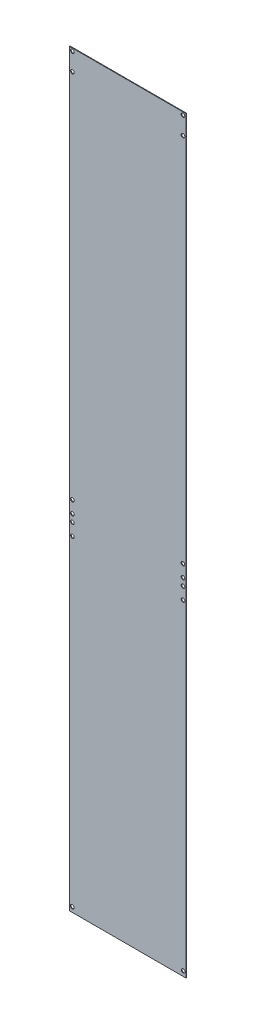
ISO-10303-21;
HEADER;
FILE_DESCRIPTION(('STEP AP214'),'2;1');
FILE_NAME('part.step','',(''),(''),'','','');
FILE_SCHEMA(('AUTOMOTIVE_DESIGN { 1 0 10303 214 1 1 1 1 }'));
ENDSEC;
DATA;
#1=APPLICATION_CONTEXT('core data for automotive mechanical design processes');
#2=APPLICATION_PROTOCOL_DEFINITION('international standard','automotive_design',2000,#1);
#3=PRODUCT_CONTEXT('',#1,'mechanical');
#4=PRODUCT('Part','Part','',(#3));
#5=PRODUCT_RELATED_PRODUCT_CATEGORY('part','',(#4));
#6=PRODUCT_DEFINITION_FORMATION('','',#4);
#7=PRODUCT_DEFINITION_CONTEXT('part definition',#1,'design');
#8=PRODUCT_DEFINITION('design','',#6,#7);
#9=PRODUCT_DEFINITION_SHAPE('','',#8);
#10=(LENGTH_UNIT() NAMED_UNIT(*) SI_UNIT(.MILLI.,.METRE.));
#11=(NAMED_UNIT(*) PLANE_ANGLE_UNIT() SI_UNIT($,.RADIAN.));
#12=(NAMED_UNIT(*) SI_UNIT($,.STERADIAN.) SOLID_ANGLE_UNIT());
#13=UNCERTAINTY_MEASURE_WITH_UNIT(LENGTH_MEASURE(1.E-05),#10,'distance_accuracy_value','');
#14=(GEOMETRIC_REPRESENTATION_CONTEXT(3) GLOBAL_UNCERTAINTY_ASSIGNED_CONTEXT((#13)) GLOBAL_UNIT_ASSIGNED_CONTEXT((#10,
#11,#12)) REPRESENTATION_CONTEXT('',''));
#15=CARTESIAN_POINT('',(0.,0.,0.));
#16=DIRECTION('',(0.,0.,1.));
#17=DIRECTION('',(1.,0.,0.));
#18=AXIS2_PLACEMENT_3D('',#15,#16,#17);
#19=CARTESIAN_POINT('',(0.,0.,3.175));
#20=DIRECTION('',(1.,0.,0.));
#21=DIRECTION('',(0.,0.,-1.));
#22=AXIS2_PLACEMENT_3D('',#19,#20,#21);
#23=PLANE('',#22);
#24=DIRECTION('',(0.,-1.,0.));
#25=VECTOR('',#24,1.);
#26=CARTESIAN_POINT('',(0.,0.,0.));
#27=LINE('',#26,#25);
#28=CARTESIAN_POINT('',(0.,3924.3,0.));
#29=VERTEX_POINT('',#28);
#30=CARTESIAN_POINT('',(0.,0.,0.));
#31=VERTEX_POINT('',#30);
#32=EDGE_CURVE('E107',#29,#31,#27,.T.);
#33=ORIENTED_EDGE('',*,*,#32,.T.);
#34=DIRECTION('',(0.,0.,-1.));
#35=VECTOR('',#34,1.);
#36=CARTESIAN_POINT('',(0.,0.,3.175));
#37=LINE('',#36,#35);
#38=CARTESIAN_POINT('',(0.,0.,3.175));
#39=VERTEX_POINT('',#38);
#40=EDGE_CURVE('E11',#39,#31,#37,.T.);
#41=ORIENTED_EDGE('',*,*,#40,.F.);
#42=DIRECTION('',(0.,-1.,0.));
#43=VECTOR('',#42,1.);
#44=CARTESIAN_POINT('',(0.,0.,3.175));
#45=LINE('',#44,#43);
#46=CARTESIAN_POINT('',(0.,3924.3,3.175));
#47=VERTEX_POINT('',#46);
#48=EDGE_CURVE('E94',#47,#39,#45,.T.);
#49=ORIENTED_EDGE('',*,*,#48,.F.);
#50=DIRECTION('',(0.,0.,-1.));
#51=VECTOR('',#50,1.);
#52=CARTESIAN_POINT('',(0.,3924.3,3.175));
#53=LINE('',#52,#51);
#54=EDGE_CURVE('E103',#47,#29,#53,.T.);
#55=ORIENTED_EDGE('',*,*,#54,.T.);
#56=EDGE_LOOP('',(#33,#41,#49,#55));
#57=FACE_BOUND('',#56,.T.);
#58=ADVANCED_FACE('F43',(#57),#23,.F.);
#59=CARTESIAN_POINT('',(0.,0.,3.175));
#60=DIRECTION('',(0.,1.,0.));
#61=DIRECTION('',(0.,0.,1.));
#62=AXIS2_PLACEMENT_3D('',#59,#60,#61);
#63=PLANE('',#62);
#64=DIRECTION('',(1.,0.,0.));
#65=VECTOR('',#64,1.);
#66=CARTESIAN_POINT('',(0.,0.,0.));
#67=LINE('',#66,#65);
#68=CARTESIAN_POINT('',(609.6,0.,0.));
#69=VERTEX_POINT('',#68);
#70=EDGE_CURVE('E98',#31,#69,#67,.T.);
#71=ORIENTED_EDGE('',*,*,#70,.T.);
#72=DIRECTION('',(0.,0.,-1.));
#73=VECTOR('',#72,1.);
#74=CARTESIAN_POINT('',(609.6,0.,3.175));
#75=LINE('',#74,#73);
#76=CARTESIAN_POINT('',(609.6,0.,3.175));
#77=VERTEX_POINT('',#76);
#78=EDGE_CURVE('E51',#77,#69,#75,.T.);
#79=ORIENTED_EDGE('',*,*,#78,.F.);
#80=DIRECTION('',(1.,0.,0.));
#81=VECTOR('',#80,1.);
#82=CARTESIAN_POINT('',(0.,0.,3.175));
#83=LINE('',#82,#81);
#84=EDGE_CURVE('E89',#39,#77,#83,.T.);
#85=ORIENTED_EDGE('',*,*,#84,.F.);
#86=ORIENTED_EDGE('',*,*,#40,.T.);
#87=EDGE_LOOP('',(#71,#79,#85,#86));
#88=FACE_BOUND('',#87,.T.);
#89=ADVANCED_FACE('F97',(#88),#63,.F.);
#90=CARTESIAN_POINT('',(609.6,0.,3.175));
#91=DIRECTION('',(-1.,0.,0.));
#92=DIRECTION('',(0.,0.,1.));
#93=AXIS2_PLACEMENT_3D('',#90,#91,#92);
#94=PLANE('',#93);
#95=DIRECTION('',(0.,1.,0.));
#96=VECTOR('',#95,1.);
#97=CARTESIAN_POINT('',(609.6,0.,0.));
#98=LINE('',#97,#96);
#99=CARTESIAN_POINT('',(609.6,3924.3,0.));
#100=VERTEX_POINT('',#99);
#101=EDGE_CURVE('E76',#69,#100,#98,.T.);
#102=ORIENTED_EDGE('',*,*,#101,.T.);
#103=DIRECTION('',(0.,0.,-1.));
#104=VECTOR('',#103,1.);
#105=CARTESIAN_POINT('',(609.6,3924.3,3.175));
#106=LINE('',#105,#104);
#107=CARTESIAN_POINT('',(609.6,3924.3,3.175));
#108=VERTEX_POINT('',#107);
#109=EDGE_CURVE('E99',#108,#100,#106,.T.);
#110=ORIENTED_EDGE('',*,*,#109,.F.);
#111=DIRECTION('',(0.,1.,0.));
#112=VECTOR('',#111,1.);
#113=CARTESIAN_POINT('',(609.6,0.,3.175));
#114=LINE('',#113,#112);
#115=EDGE_CURVE('E92',#77,#108,#114,.T.);
#116=ORIENTED_EDGE('',*,*,#115,.F.);
#117=ORIENTED_EDGE('',*,*,#78,.T.);
#118=EDGE_LOOP('',(#102,#110,#116,#117));
#119=FACE_BOUND('',#118,.T.);
#120=ADVANCED_FACE('F100',(#119),#94,.F.);
#121=CARTESIAN_POINT('',(0.,3924.3,3.175));
#122=DIRECTION('',(0.,-1.,0.));
#123=DIRECTION('',(0.,0.,-1.));
#124=AXIS2_PLACEMENT_3D('',#121,#122,#123);
#125=PLANE('',#124);
#126=DIRECTION('',(-1.,0.,0.));
#127=VECTOR('',#126,1.);
#128=CARTESIAN_POINT('',(0.,3924.3,0.));
#129=LINE('',#128,#127);
#130=EDGE_CURVE('E82',#100,#29,#129,.T.);
#131=ORIENTED_EDGE('',*,*,#130,.T.);
#132=ORIENTED_EDGE('',*,*,#54,.F.);
#133=DIRECTION('',(-1.,0.,0.));
#134=VECTOR('',#133,1.);
#135=CARTESIAN_POINT('',(0.,3924.3,3.175));
#136=LINE('',#135,#134);
#137=EDGE_CURVE('E59',#108,#47,#136,.T.);
#138=ORIENTED_EDGE('',*,*,#137,.F.);
#139=ORIENTED_EDGE('',*,*,#109,.T.);
#140=EDGE_LOOP('',(#131,#132,#138,#139));
#141=FACE_BOUND('',#140,.T.);
#142=ADVANCED_FACE('F117',(#141),#125,.F.);
#143=CARTESIAN_POINT('',(0.,0.,3.175));
#144=DIRECTION('',(0.,0.,-1.));
#145=DIRECTION('',(-1.,0.,0.));
#146=AXIS2_PLACEMENT_3D('',#143,#144,#145);
#147=PLANE('',#146);
#148=CARTESIAN_POINT('',(15.0837899999731,3816.34999999999,3.175));
#149=DIRECTION('',(0.,0.,-1.));
#150=DIRECTION('',(-1.,0.,0.));
#151=AXIS2_PLACEMENT_3D('',#148,#149,#150);
#152=CIRCLE('',#151,9.52500000000003);
#153=CARTESIAN_POINT('',(5.55878999997309,3816.34999999999,3.175));
#154=VERTEX_POINT('',#153);
#155=EDGE_CURVE('E157',#154,#154,#152,.T.);
#156=ORIENTED_EDGE('',*,*,#155,.T.);
#157=EDGE_LOOP('',(#156));
#158=FACE_BOUND('',#157,.T.);
#159=CARTESIAN_POINT('',(15.0837899999731,3909.25049999999,3.175));
#160=DIRECTION('',(0.,0.,-1.));
#161=DIRECTION('',(-1.,0.,0.));
#162=AXIS2_PLACEMENT_3D('',#159,#160,#161);
#163=CIRCLE('',#162,9.52500000000003);
#164=CARTESIAN_POINT('',(5.55878999997309,3909.25049999999,3.175));
#165=VERTEX_POINT('',#164);
#166=EDGE_CURVE('E166',#165,#165,#163,.T.);
#167=ORIENTED_EDGE('',*,*,#166,.T.);
#168=EDGE_LOOP('',(#167));
#169=FACE_BOUND('',#168,.T.);
#170=CARTESIAN_POINT('',(595.624919999987,25.3999999999857,3.175));
#171=DIRECTION('',(0.,0.,-1.));
#172=DIRECTION('',(-1.,0.,0.));
#173=AXIS2_PLACEMENT_3D('',#170,#171,#172);
#174=CIRCLE('',#173,9.52500000000002);
#175=CARTESIAN_POINT('',(586.099919999987,25.3999999999857,3.175));
#176=VERTEX_POINT('',#175);
#177=EDGE_CURVE('E174',#176,#176,#174,.T.);
#178=ORIENTED_EDGE('',*,*,#177,.T.);
#179=EDGE_LOOP('',(#178));
#180=FACE_BOUND('',#179,.T.);
#181=CARTESIAN_POINT('',(594.516209999955,1708.16015999999,3.175));
#182=DIRECTION('',(0.,0.,-1.));
#183=DIRECTION('',(-1.,0.,0.));
#184=AXIS2_PLACEMENT_3D('',#181,#182,#183);
#185=CIRCLE('',#184,9.52500000000005);
#186=CARTESIAN_POINT('',(584.991209999954,1708.16015999999,3.175));
#187=VERTEX_POINT('',#186);
#188=EDGE_CURVE('E180',#187,#187,#185,.T.);
#189=ORIENTED_EDGE('',*,*,#188,.T.);
#190=EDGE_LOOP('',(#189));
#191=FACE_BOUND('',#190,.T.);
#192=CARTESIAN_POINT('',(594.516209999953,1771.64999999999,3.175));
#193=DIRECTION('',(0.,0.,-1.));
#194=DIRECTION('',(-1.,0.,0.));
#195=AXIS2_PLACEMENT_3D('',#192,#193,#194);
#196=CIRCLE('',#195,9.52500000000005);
#197=CARTESIAN_POINT('',(584.991209999953,1771.64999999999,3.175));
#198=VERTEX_POINT('',#197);
#199=EDGE_CURVE('E131',#198,#198,#196,.T.);
#200=ORIENTED_EDGE('',*,*,#199,.T.);
#201=EDGE_LOOP('',(#200));
#202=FACE_BOUND('',#201,.T.);
#203=CARTESIAN_POINT('',(594.516209999973,1809.74999999999,3.175));
#204=DIRECTION('',(0.,0.,-1.));
#205=DIRECTION('',(-1.,0.,0.));
#206=AXIS2_PLACEMENT_3D('',#203,#204,#205);
#207=CIRCLE('',#206,9.52500000000005);
#208=CARTESIAN_POINT('',(584.991209999973,1809.74999999999,3.175));
#209=VERTEX_POINT('',#208);
#210=EDGE_CURVE('E138',#209,#209,#207,.T.);
#211=ORIENTED_EDGE('',*,*,#210,.T.);
#212=EDGE_LOOP('',(#211));
#213=FACE_BOUND('',#212,.T.);
#214=CARTESIAN_POINT('',(594.516209999993,1873.24491999999,3.175));
#215=DIRECTION('',(0.,0.,-1.));
#216=DIRECTION('',(-1.,0.,0.));
#217=AXIS2_PLACEMENT_3D('',#214,#215,#216);
#218=CIRCLE('',#217,9.52500000000005);
#219=CARTESIAN_POINT('',(584.991209999993,1873.24491999999,3.175));
#220=VERTEX_POINT('',#219);
#221=EDGE_CURVE('E146',#220,#220,#218,.T.);
#222=ORIENTED_EDGE('',*,*,#221,.T.);
#223=EDGE_LOOP('',(#222));
#224=FACE_BOUND('',#223,.T.);
#225=CARTESIAN_POINT('',(594.516209999955,3816.34999999999,3.175));
#226=DIRECTION('',(0.,0.,-1.));
#227=DIRECTION('',(-1.,0.,0.));
#228=AXIS2_PLACEMENT_3D('',#225,#226,#227);
#229=CIRCLE('',#228,9.52500000000005);
#230=CARTESIAN_POINT('',(584.991209999955,3816.34999999999,3.175));
#231=VERTEX_POINT('',#230);
#232=EDGE_CURVE('E152',#231,#231,#229,.T.);
#233=ORIENTED_EDGE('',*,*,#232,.T.);
#234=EDGE_LOOP('',(#233));
#235=FACE_BOUND('',#234,.T.);
#236=CARTESIAN_POINT('',(15.0837899999735,1873.24491999999,3.175));
#237=DIRECTION('',(0.,0.,-1.));
#238=DIRECTION('',(-1.,0.,0.));
#239=AXIS2_PLACEMENT_3D('',#236,#237,#238);
#240=CIRCLE('',#239,9.52500000000003);
#241=CARTESIAN_POINT('',(5.55878999997348,1873.24491999999,3.175));
#242=VERTEX_POINT('',#241);
#243=EDGE_CURVE('E214',#242,#242,#240,.T.);
#244=ORIENTED_EDGE('',*,*,#243,.T.);
#245=EDGE_LOOP('',(#244));
#246=FACE_BOUND('',#245,.T.);
#247=CARTESIAN_POINT('',(15.0837899999735,1809.74999999999,3.175));
#248=DIRECTION('',(0.,0.,-1.));
#249=DIRECTION('',(-1.,0.,0.));
#250=AXIS2_PLACEMENT_3D('',#247,#248,#249);
#251=CIRCLE('',#250,9.52500000000003);
#252=CARTESIAN_POINT('',(5.55878999997348,1809.74999999999,3.175));
#253=VERTEX_POINT('',#252);
#254=EDGE_CURVE('E206',#253,#253,#251,.T.);
#255=ORIENTED_EDGE('',*,*,#254,.T.);
#256=EDGE_LOOP('',(#255));
#257=FACE_BOUND('',#256,.T.);
#258=CARTESIAN_POINT('',(15.0837899999735,1771.64999999999,3.175));
#259=DIRECTION('',(0.,0.,-1.));
#260=DIRECTION('',(-1.,0.,0.));
#261=AXIS2_PLACEMENT_3D('',#258,#259,#260);
#262=CIRCLE('',#261,9.52500000000003);
#263=CARTESIAN_POINT('',(5.55878999997348,1771.64999999999,3.175));
#264=VERTEX_POINT('',#263);
#265=EDGE_CURVE('E198',#264,#264,#262,.T.);
#266=ORIENTED_EDGE('',*,*,#265,.T.);
#267=EDGE_LOOP('',(#266));
#268=FACE_BOUND('',#267,.T.);
#269=CARTESIAN_POINT('',(15.0837899999735,1708.16015999999,3.175));
#270=DIRECTION('',(0.,0.,-1.));
#271=DIRECTION('',(-1.,0.,0.));
#272=AXIS2_PLACEMENT_3D('',#269,#270,#271);
#273=CIRCLE('',#272,9.52500000000003);
#274=CARTESIAN_POINT('',(5.55878999997348,1708.16015999999,3.175));
#275=VERTEX_POINT('',#274);
#276=EDGE_CURVE('E191',#275,#275,#273,.T.);
#277=ORIENTED_EDGE('',*,*,#276,.T.);
#278=EDGE_LOOP('',(#277));
#279=FACE_BOUND('',#278,.T.);
#280=CARTESIAN_POINT('',(13.9750799999746,25.3999999999857,3.175));
#281=DIRECTION('',(0.,0.,-1.));
#282=DIRECTION('',(-1.,0.,0.));
#283=AXIS2_PLACEMENT_3D('',#280,#281,#282);
#284=CIRCLE('',#283,9.525);
#285=CARTESIAN_POINT('',(4.4500799999746,25.3999999999857,3.175));
#286=VERTEX_POINT('',#285);
#287=EDGE_CURVE('E185',#286,#286,#284,.T.);
#288=ORIENTED_EDGE('',*,*,#287,.T.);
#289=EDGE_LOOP('',(#288));
#290=FACE_BOUND('',#289,.T.);
#291=CARTESIAN_POINT('',(594.516209999953,3909.25049999999,3.175));
#292=DIRECTION('',(0.,0.,-1.));
#293=DIRECTION('',(-1.,0.,0.));
#294=AXIS2_PLACEMENT_3D('',#291,#292,#293);
#295=CIRCLE('',#294,9.52500000000005);
#296=CARTESIAN_POINT('',(584.991209999953,3909.25049999999,3.175));
#297=VERTEX_POINT('',#296);
#298=EDGE_CURVE('E111',#297,#297,#295,.T.);
#299=ORIENTED_EDGE('',*,*,#298,.T.);
#300=EDGE_LOOP('',(#299));
#301=FACE_BOUND('',#300,.T.);
#302=ORIENTED_EDGE('',*,*,#48,.T.);
#303=ORIENTED_EDGE('',*,*,#84,.T.);
#304=ORIENTED_EDGE('',*,*,#115,.T.);
#305=ORIENTED_EDGE('',*,*,#137,.T.);
#306=EDGE_LOOP('',(#302,#303,#304,#305));
#307=FACE_BOUND('',#306,.T.);
#308=ADVANCED_FACE('F90',(#158,#169,#180,#191,#202,#213,#224,#235,#246,#257,#268,#279,#290,#301,
#307),#147,.F.);
#309=CARTESIAN_POINT('',(0.,0.,0.));
#310=DIRECTION('',(0.,0.,-1.));
#311=DIRECTION('',(-1.,0.,0.));
#312=AXIS2_PLACEMENT_3D('',#309,#310,#311);
#313=PLANE('',#312);
#314=CARTESIAN_POINT('',(15.0837899999731,3816.34999999999,0.));
#315=DIRECTION('',(0.,0.,-1.));
#316=DIRECTION('',(-1.,0.,0.));
#317=AXIS2_PLACEMENT_3D('',#314,#315,#316);
#318=CIRCLE('',#317,9.52500000000003);
#319=CARTESIAN_POINT('',(5.55878999997309,3816.34999999999,0.));
#320=VERTEX_POINT('',#319);
#321=EDGE_CURVE('E161',#320,#320,#318,.T.);
#322=ORIENTED_EDGE('',*,*,#321,.F.);
#323=EDGE_LOOP('',(#322));
#324=FACE_BOUND('',#323,.T.);
#325=CARTESIAN_POINT('',(15.0837899999731,3909.25049999999,0.));
#326=DIRECTION('',(0.,0.,-1.));
#327=DIRECTION('',(-1.,0.,0.));
#328=AXIS2_PLACEMENT_3D('',#325,#326,#327);
#329=CIRCLE('',#328,9.52500000000003);
#330=CARTESIAN_POINT('',(5.55878999997309,3909.25049999999,0.));
#331=VERTEX_POINT('',#330);
#332=EDGE_CURVE('E170',#331,#331,#329,.T.);
#333=ORIENTED_EDGE('',*,*,#332,.F.);
#334=EDGE_LOOP('',(#333));
#335=FACE_BOUND('',#334,.T.);
#336=CARTESIAN_POINT('',(595.624919999987,25.3999999999857,0.));
#337=DIRECTION('',(0.,0.,-1.));
#338=DIRECTION('',(-1.,0.,0.));
#339=AXIS2_PLACEMENT_3D('',#336,#337,#338);
#340=CIRCLE('',#339,9.52500000000002);
#341=CARTESIAN_POINT('',(586.099919999987,25.3999999999857,0.));
#342=VERTEX_POINT('',#341);
#343=EDGE_CURVE('E177',#342,#342,#340,.T.);
#344=ORIENTED_EDGE('',*,*,#343,.F.);
#345=EDGE_LOOP('',(#344));
#346=FACE_BOUND('',#345,.T.);
#347=CARTESIAN_POINT('',(594.516209999955,1708.16015999999,0.));
#348=DIRECTION('',(0.,0.,-1.));
#349=DIRECTION('',(-1.,0.,0.));
#350=AXIS2_PLACEMENT_3D('',#347,#348,#349);
#351=CIRCLE('',#350,9.52500000000005);
#352=CARTESIAN_POINT('',(584.991209999954,1708.16015999999,0.));
#353=VERTEX_POINT('',#352);
#354=EDGE_CURVE('E135',#353,#353,#351,.T.);
#355=ORIENTED_EDGE('',*,*,#354,.F.);
#356=EDGE_LOOP('',(#355));
#357=FACE_BOUND('',#356,.T.);
#358=CARTESIAN_POINT('',(594.516209999953,1771.64999999999,0.));
#359=DIRECTION('',(0.,0.,-1.));
#360=DIRECTION('',(-1.,0.,0.));
#361=AXIS2_PLACEMENT_3D('',#358,#359,#360);
#362=CIRCLE('',#361,9.52500000000005);
#363=CARTESIAN_POINT('',(584.991209999953,1771.64999999999,0.));
#364=VERTEX_POINT('',#363);
#365=EDGE_CURVE('E134',#364,#364,#362,.T.);
#366=ORIENTED_EDGE('',*,*,#365,.F.);
#367=EDGE_LOOP('',(#366));
#368=FACE_BOUND('',#367,.T.);
#369=CARTESIAN_POINT('',(594.516209999973,1809.74999999999,0.));
#370=DIRECTION('',(0.,0.,-1.));
#371=DIRECTION('',(-1.,0.,0.));
#372=AXIS2_PLACEMENT_3D('',#369,#370,#371);
#373=CIRCLE('',#372,9.52500000000005);
#374=CARTESIAN_POINT('',(584.991209999973,1809.74999999999,0.));
#375=VERTEX_POINT('',#374);
#376=EDGE_CURVE('E142',#375,#375,#373,.T.);
#377=ORIENTED_EDGE('',*,*,#376,.F.);
#378=EDGE_LOOP('',(#377));
#379=FACE_BOUND('',#378,.T.);
#380=CARTESIAN_POINT('',(594.516209999993,1873.24491999999,0.));
#381=DIRECTION('',(0.,0.,-1.));
#382=DIRECTION('',(-1.,0.,0.));
#383=AXIS2_PLACEMENT_3D('',#380,#381,#382);
#384=CIRCLE('',#383,9.52500000000005);
#385=CARTESIAN_POINT('',(584.991209999993,1873.24491999999,0.));
#386=VERTEX_POINT('',#385);
#387=EDGE_CURVE('E149',#386,#386,#384,.T.);
#388=ORIENTED_EDGE('',*,*,#387,.F.);
#389=EDGE_LOOP('',(#388));
#390=FACE_BOUND('',#389,.T.);
#391=CARTESIAN_POINT('',(594.516209999955,3816.34999999999,0.));
#392=DIRECTION('',(0.,0.,-1.));
#393=DIRECTION('',(-1.,0.,0.));
#394=AXIS2_PLACEMENT_3D('',#391,#392,#393);
#395=CIRCLE('',#394,9.52500000000005);
#396=CARTESIAN_POINT('',(584.991209999955,3816.34999999999,0.));
#397=VERTEX_POINT('',#396);
#398=EDGE_CURVE('E128',#397,#397,#395,.T.);
#399=ORIENTED_EDGE('',*,*,#398,.F.);
#400=EDGE_LOOP('',(#399));
#401=FACE_BOUND('',#400,.T.);
#402=CARTESIAN_POINT('',(15.0837899999735,1873.24491999999,0.));
#403=DIRECTION('',(0.,0.,-1.));
#404=DIRECTION('',(-1.,0.,0.));
#405=AXIS2_PLACEMENT_3D('',#402,#403,#404);
#406=CIRCLE('',#405,9.52500000000003);
#407=CARTESIAN_POINT('',(5.55878999997348,1873.24491999999,0.));
#408=VERTEX_POINT('',#407);
#409=EDGE_CURVE('E162',#408,#408,#406,.T.);
#410=ORIENTED_EDGE('',*,*,#409,.F.);
#411=EDGE_LOOP('',(#410));
#412=FACE_BOUND('',#411,.T.);
#413=CARTESIAN_POINT('',(15.0837899999735,1809.74999999999,0.));
#414=DIRECTION('',(0.,0.,-1.));
#415=DIRECTION('',(-1.,0.,0.));
#416=AXIS2_PLACEMENT_3D('',#413,#414,#415);
#417=CIRCLE('',#416,9.52500000000003);
#418=CARTESIAN_POINT('',(5.55878999997348,1809.74999999999,0.));
#419=VERTEX_POINT('',#418);
#420=EDGE_CURVE('E210',#419,#419,#417,.T.);
#421=ORIENTED_EDGE('',*,*,#420,.F.);
#422=EDGE_LOOP('',(#421));
#423=FACE_BOUND('',#422,.T.);
#424=CARTESIAN_POINT('',(15.0837899999735,1771.64999999999,0.));
#425=DIRECTION('',(0.,0.,-1.));
#426=DIRECTION('',(-1.,0.,0.));
#427=AXIS2_PLACEMENT_3D('',#424,#425,#426);
#428=CIRCLE('',#427,9.52500000000003);
#429=CARTESIAN_POINT('',(5.55878999997348,1771.64999999999,0.));
#430=VERTEX_POINT('',#429);
#431=EDGE_CURVE('E202',#430,#430,#428,.T.);
#432=ORIENTED_EDGE('',*,*,#431,.F.);
#433=EDGE_LOOP('',(#432));
#434=FACE_BOUND('',#433,.T.);
#435=CARTESIAN_POINT('',(15.0837899999735,1708.16015999999,0.));
#436=DIRECTION('',(0.,0.,-1.));
#437=DIRECTION('',(-1.,0.,0.));
#438=AXIS2_PLACEMENT_3D('',#435,#436,#437);
#439=CIRCLE('',#438,9.52500000000003);
#440=CARTESIAN_POINT('',(5.55878999997348,1708.16015999999,0.));
#441=VERTEX_POINT('',#440);
#442=EDGE_CURVE('E195',#441,#441,#439,.T.);
#443=ORIENTED_EDGE('',*,*,#442,.F.);
#444=EDGE_LOOP('',(#443));
#445=FACE_BOUND('',#444,.T.);
#446=CARTESIAN_POINT('',(13.9750799999746,25.3999999999857,0.));
#447=DIRECTION('',(0.,0.,-1.));
#448=DIRECTION('',(-1.,0.,0.));
#449=AXIS2_PLACEMENT_3D('',#446,#447,#448);
#450=CIRCLE('',#449,9.525);
#451=CARTESIAN_POINT('',(4.4500799999746,25.3999999999857,0.));
#452=VERTEX_POINT('',#451);
#453=EDGE_CURVE('E188',#452,#452,#450,.T.);
#454=ORIENTED_EDGE('',*,*,#453,.F.);
#455=EDGE_LOOP('',(#454));
#456=FACE_BOUND('',#455,.T.);
#457=CARTESIAN_POINT('',(594.516209999953,3909.25049999999,0.));
#458=DIRECTION('',(0.,0.,-1.));
#459=DIRECTION('',(-1.,0.,0.));
#460=AXIS2_PLACEMENT_3D('',#457,#458,#459);
#461=CIRCLE('',#460,9.52500000000005);
#462=CARTESIAN_POINT('',(584.991209999953,3909.25049999999,0.));
#463=VERTEX_POINT('',#462);
#464=EDGE_CURVE('E125',#463,#463,#461,.T.);
#465=ORIENTED_EDGE('',*,*,#464,.F.);
#466=EDGE_LOOP('',(#465));
#467=FACE_BOUND('',#466,.T.);
#468=ORIENTED_EDGE('',*,*,#32,.F.);
#469=ORIENTED_EDGE('',*,*,#130,.F.);
#470=ORIENTED_EDGE('',*,*,#101,.F.);
#471=ORIENTED_EDGE('',*,*,#70,.F.);
#472=EDGE_LOOP('',(#468,#469,#470,#471));
#473=FACE_BOUND('',#472,.T.);
#474=ADVANCED_FACE('F120',(#324,#335,#346,#357,#368,#379,#390,#401,#412,#423,#434,#445,#456,
#467,#473),#313,.T.);
#475=CARTESIAN_POINT('',(594.516209999953,3909.25049999999,3.175));
#476=DIRECTION('',(0.,0.,-1.));
#477=DIRECTION('',(-1.,0.,0.));
#478=AXIS2_PLACEMENT_3D('',#475,#476,#477);
#479=CYLINDRICAL_SURFACE('',#478,9.52500000000005);
#480=ORIENTED_EDGE('',*,*,#298,.F.);
#481=EDGE_LOOP('',(#480));
#482=FACE_BOUND('',#481,.T.);
#483=ORIENTED_EDGE('',*,*,#464,.T.);
#484=EDGE_LOOP('',(#483));
#485=FACE_BOUND('',#484,.T.);
#486=ADVANCED_FACE('F224',(#482,#485),#479,.F.);
#487=CARTESIAN_POINT('',(13.9750799999746,25.3999999999857,3.175));
#488=DIRECTION('',(0.,0.,-1.));
#489=DIRECTION('',(-1.,0.,0.));
#490=AXIS2_PLACEMENT_3D('',#487,#488,#489);
#491=CYLINDRICAL_SURFACE('',#490,9.525);
#492=ORIENTED_EDGE('',*,*,#287,.F.);
#493=EDGE_LOOP('',(#492));
#494=FACE_BOUND('',#493,.T.);
#495=ORIENTED_EDGE('',*,*,#453,.T.);
#496=EDGE_LOOP('',(#495));
#497=FACE_BOUND('',#496,.T.);
#498=ADVANCED_FACE('F238',(#494,#497),#491,.F.);
#499=CARTESIAN_POINT('',(15.0837899999735,1708.16015999999,3.175));
#500=DIRECTION('',(0.,0.,-1.));
#501=DIRECTION('',(-1.,0.,0.));
#502=AXIS2_PLACEMENT_3D('',#499,#500,#501);
#503=CYLINDRICAL_SURFACE('',#502,9.52500000000003);
#504=ORIENTED_EDGE('',*,*,#276,.F.);
#505=EDGE_LOOP('',(#504));
#506=FACE_BOUND('',#505,.T.);
#507=ORIENTED_EDGE('',*,*,#442,.T.);
#508=EDGE_LOOP('',(#507));
#509=FACE_BOUND('',#508,.T.);
#510=ADVANCED_FACE('F244',(#506,#509),#503,.F.);
#511=CARTESIAN_POINT('',(15.0837899999735,1771.64999999999,3.175));
#512=DIRECTION('',(0.,0.,-1.));
#513=DIRECTION('',(-1.,0.,0.));
#514=AXIS2_PLACEMENT_3D('',#511,#512,#513);
#515=CYLINDRICAL_SURFACE('',#514,9.52500000000003);
#516=ORIENTED_EDGE('',*,*,#265,.F.);
#517=EDGE_LOOP('',(#516));
#518=FACE_BOUND('',#517,.T.);
#519=ORIENTED_EDGE('',*,*,#431,.T.);
#520=EDGE_LOOP('',(#519));
#521=FACE_BOUND('',#520,.T.);
#522=ADVANCED_FACE('F294',(#518,#521),#515,.F.);
#523=CARTESIAN_POINT('',(15.0837899999735,1809.74999999999,3.175));
#524=DIRECTION('',(0.,0.,-1.));
#525=DIRECTION('',(-1.,0.,0.));
#526=AXIS2_PLACEMENT_3D('',#523,#524,#525);
#527=CYLINDRICAL_SURFACE('',#526,9.52500000000003);
#528=ORIENTED_EDGE('',*,*,#254,.F.);
#529=EDGE_LOOP('',(#528));
#530=FACE_BOUND('',#529,.T.);
#531=ORIENTED_EDGE('',*,*,#420,.T.);
#532=EDGE_LOOP('',(#531));
#533=FACE_BOUND('',#532,.T.);
#534=ADVANCED_FACE('F299',(#530,#533),#527,.F.);
#535=CARTESIAN_POINT('',(15.0837899999735,1873.24491999999,3.175));
#536=DIRECTION('',(0.,0.,-1.));
#537=DIRECTION('',(-1.,0.,0.));
#538=AXIS2_PLACEMENT_3D('',#535,#536,#537);
#539=CYLINDRICAL_SURFACE('',#538,9.52500000000003);
#540=ORIENTED_EDGE('',*,*,#243,.F.);
#541=EDGE_LOOP('',(#540));
#542=FACE_BOUND('',#541,.T.);
#543=ORIENTED_EDGE('',*,*,#409,.T.);
#544=EDGE_LOOP('',(#543));
#545=FACE_BOUND('',#544,.T.);
#546=ADVANCED_FACE('F220',(#542,#545),#539,.F.);
#547=CARTESIAN_POINT('',(594.516209999955,3816.34999999999,3.175));
#548=DIRECTION('',(0.,0.,-1.));
#549=DIRECTION('',(-1.,0.,0.));
#550=AXIS2_PLACEMENT_3D('',#547,#548,#549);
#551=CYLINDRICAL_SURFACE('',#550,9.52500000000005);
#552=ORIENTED_EDGE('',*,*,#232,.F.);
#553=EDGE_LOOP('',(#552));
#554=FACE_BOUND('',#553,.T.);
#555=ORIENTED_EDGE('',*,*,#398,.T.);
#556=EDGE_LOOP('',(#555));
#557=FACE_BOUND('',#556,.T.);
#558=ADVANCED_FACE('F321',(#554,#557),#551,.F.);
#559=CARTESIAN_POINT('',(594.516209999993,1873.24491999999,3.175));
#560=DIRECTION('',(0.,0.,-1.));
#561=DIRECTION('',(-1.,0.,0.));
#562=AXIS2_PLACEMENT_3D('',#559,#560,#561);
#563=CYLINDRICAL_SURFACE('',#562,9.52500000000005);
#564=ORIENTED_EDGE('',*,*,#221,.F.);
#565=EDGE_LOOP('',(#564));
#566=FACE_BOUND('',#565,.T.);
#567=ORIENTED_EDGE('',*,*,#387,.T.);
#568=EDGE_LOOP('',(#567));
#569=FACE_BOUND('',#568,.T.);
#570=ADVANCED_FACE('F324',(#566,#569),#563,.F.);
#571=CARTESIAN_POINT('',(594.516209999973,1809.74999999999,3.175));
#572=DIRECTION('',(0.,0.,-1.));
#573=DIRECTION('',(-1.,0.,0.));
#574=AXIS2_PLACEMENT_3D('',#571,#572,#573);
#575=CYLINDRICAL_SURFACE('',#574,9.52500000000005);
#576=ORIENTED_EDGE('',*,*,#210,.F.);
#577=EDGE_LOOP('',(#576));
#578=FACE_BOUND('',#577,.T.);
#579=ORIENTED_EDGE('',*,*,#376,.T.);
#580=EDGE_LOOP('',(#579));
#581=FACE_BOUND('',#580,.T.);
#582=ADVANCED_FACE('F328',(#578,#581),#575,.F.);
#583=CARTESIAN_POINT('',(594.516209999953,1771.64999999999,3.175));
#584=DIRECTION('',(0.,0.,-1.));
#585=DIRECTION('',(-1.,0.,0.));
#586=AXIS2_PLACEMENT_3D('',#583,#584,#585);
#587=CYLINDRICAL_SURFACE('',#586,9.52500000000005);
#588=ORIENTED_EDGE('',*,*,#199,.F.);
#589=EDGE_LOOP('',(#588));
#590=FACE_BOUND('',#589,.T.);
#591=ORIENTED_EDGE('',*,*,#365,.T.);
#592=EDGE_LOOP('',(#591));
#593=FACE_BOUND('',#592,.T.);
#594=ADVANCED_FACE('F308',(#590,#593),#587,.F.);
#595=CARTESIAN_POINT('',(594.516209999955,1708.16015999999,3.175));
#596=DIRECTION('',(0.,0.,-1.));
#597=DIRECTION('',(-1.,0.,0.));
#598=AXIS2_PLACEMENT_3D('',#595,#596,#597);
#599=CYLINDRICAL_SURFACE('',#598,9.52500000000005);
#600=ORIENTED_EDGE('',*,*,#188,.F.);
#601=EDGE_LOOP('',(#600));
#602=FACE_BOUND('',#601,.T.);
#603=ORIENTED_EDGE('',*,*,#354,.T.);
#604=EDGE_LOOP('',(#603));
#605=FACE_BOUND('',#604,.T.);
#606=ADVANCED_FACE('F304',(#602,#605),#599,.F.);
#607=CARTESIAN_POINT('',(595.624919999987,25.3999999999857,3.175));
#608=DIRECTION('',(0.,0.,-1.));
#609=DIRECTION('',(-1.,0.,0.));
#610=AXIS2_PLACEMENT_3D('',#607,#608,#609);
#611=CYLINDRICAL_SURFACE('',#610,9.52500000000002);
#612=ORIENTED_EDGE('',*,*,#177,.F.);
#613=EDGE_LOOP('',(#612));
#614=FACE_BOUND('',#613,.T.);
#615=ORIENTED_EDGE('',*,*,#343,.T.);
#616=EDGE_LOOP('',(#615));
#617=FACE_BOUND('',#616,.T.);
#618=ADVANCED_FACE('F307',(#614,#617),#611,.F.);
#619=CARTESIAN_POINT('',(15.0837899999731,3909.25049999999,3.175));
#620=DIRECTION('',(0.,0.,-1.));
#621=DIRECTION('',(-1.,0.,0.));
#622=AXIS2_PLACEMENT_3D('',#619,#620,#621);
#623=CYLINDRICAL_SURFACE('',#622,9.52500000000003);
#624=ORIENTED_EDGE('',*,*,#166,.F.);
#625=EDGE_LOOP('',(#624));
#626=FACE_BOUND('',#625,.T.);
#627=ORIENTED_EDGE('',*,*,#332,.T.);
#628=EDGE_LOOP('',(#627));
#629=FACE_BOUND('',#628,.T.);
#630=ADVANCED_FACE('F312',(#626,#629),#623,.F.);
#631=CARTESIAN_POINT('',(15.0837899999731,3816.34999999999,3.175));
#632=DIRECTION('',(0.,0.,-1.));
#633=DIRECTION('',(-1.,0.,0.));
#634=AXIS2_PLACEMENT_3D('',#631,#632,#633);
#635=CYLINDRICAL_SURFACE('',#634,9.52500000000003);
#636=ORIENTED_EDGE('',*,*,#155,.F.);
#637=EDGE_LOOP('',(#636));
#638=FACE_BOUND('',#637,.T.);
#639=ORIENTED_EDGE('',*,*,#321,.T.);
#640=EDGE_LOOP('',(#639));
#641=FACE_BOUND('',#640,.T.);
#642=ADVANCED_FACE('F316',(#638,#641),#635,.F.);
#643=CLOSED_SHELL('',(#58,#89,#120,#142,#308,#474,#486,#498,#510,#522,#534,#546,#558,#570,#582,
#594,#606,#618,#630,#642));
#644=MANIFOLD_SOLID_BREP('B2',#643);
#645=ADVANCED_BREP_SHAPE_REPRESENTATION('',(#18,#644),#14);
#646=SHAPE_DEFINITION_REPRESENTATION(#9,#645);
ENDSEC;
END-ISO-10303-21;
